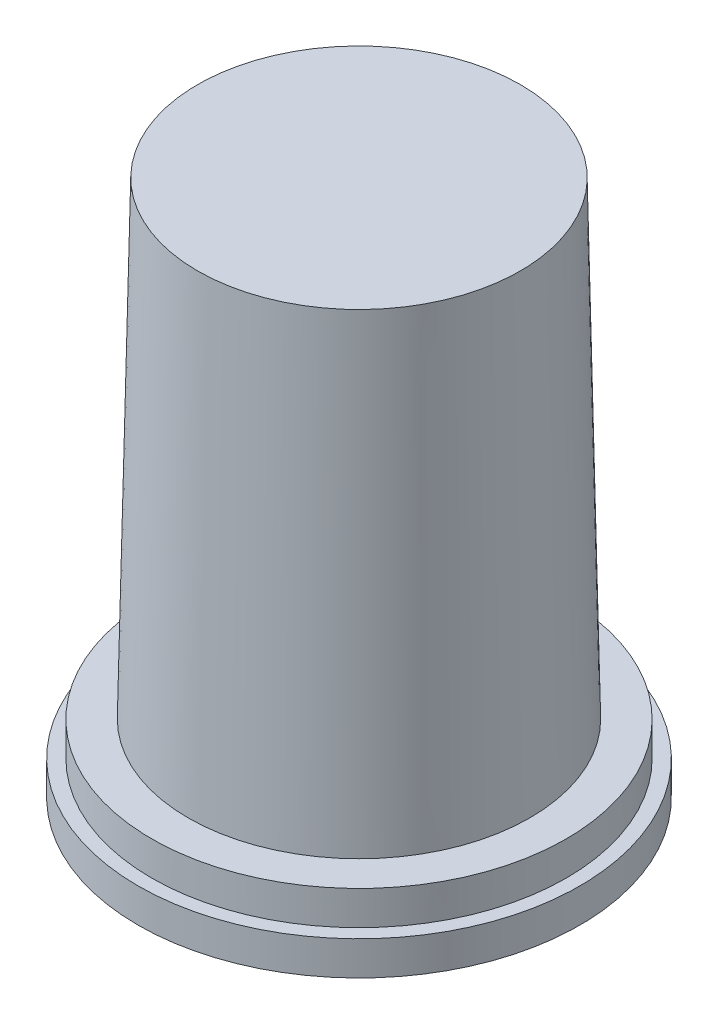
ISO-10303-21;
HEADER;
FILE_DESCRIPTION(('STEP AP214'),'2;1');
FILE_NAME('part.step','',(''),(''),'','','');
FILE_SCHEMA(('AUTOMOTIVE_DESIGN { 1 0 10303 214 1 1 1 1 }'));
ENDSEC;
DATA;
#1=APPLICATION_CONTEXT('core data for automotive mechanical design processes');
#2=APPLICATION_PROTOCOL_DEFINITION('international standard','automotive_design',2000,#1);
#3=PRODUCT_CONTEXT('',#1,'mechanical');
#4=PRODUCT('Part','Part','',(#3));
#5=PRODUCT_RELATED_PRODUCT_CATEGORY('part','',(#4));
#6=PRODUCT_DEFINITION_FORMATION('','',#4);
#7=PRODUCT_DEFINITION_CONTEXT('part definition',#1,'design');
#8=PRODUCT_DEFINITION('design','',#6,#7);
#9=PRODUCT_DEFINITION_SHAPE('','',#8);
#10=(LENGTH_UNIT() NAMED_UNIT(*) SI_UNIT(.MILLI.,.METRE.));
#11=(NAMED_UNIT(*) PLANE_ANGLE_UNIT() SI_UNIT($,.RADIAN.));
#12=(NAMED_UNIT(*) SI_UNIT($,.STERADIAN.) SOLID_ANGLE_UNIT());
#13=UNCERTAINTY_MEASURE_WITH_UNIT(LENGTH_MEASURE(1.E-05),#10,'distance_accuracy_value','');
#14=(GEOMETRIC_REPRESENTATION_CONTEXT(3) GLOBAL_UNCERTAINTY_ASSIGNED_CONTEXT((#13)) GLOBAL_UNIT_ASSIGNED_CONTEXT((#10,
#11,#12)) REPRESENTATION_CONTEXT('',''));
#15=CARTESIAN_POINT('',(0.,0.,0.));
#16=DIRECTION('',(0.,0.,1.));
#17=DIRECTION('',(1.,0.,0.));
#18=AXIS2_PLACEMENT_3D('',#15,#16,#17);
#19=CARTESIAN_POINT('',(5.05,1.,0.));
#20=DIRECTION('',(0.,1.,0.));
#21=DIRECTION('',(0.,0.,1.));
#22=AXIS2_PLACEMENT_3D('',#19,#20,#21);
#23=PLANE('',#22);
#24=CARTESIAN_POINT('',(0.,1.,0.));
#25=DIRECTION('',(0.,1.,0.));
#26=DIRECTION('',(0.,0.,1.));
#27=AXIS2_PLACEMENT_3D('',#24,#25,#26);
#28=CIRCLE('',#27,6.1);
#29=CARTESIAN_POINT('',(0.,1.,6.1));
#30=VERTEX_POINT('',#29);
#31=EDGE_CURVE('E50',#30,#30,#28,.T.);
#32=ORIENTED_EDGE('',*,*,#31,.F.);
#33=EDGE_LOOP('',(#32));
#34=FACE_BOUND('',#33,.T.);
#35=CARTESIAN_POINT('',(0.,1.,0.));
#36=DIRECTION('',(0.,-1.,0.));
#37=DIRECTION('',(0.,0.,-1.));
#38=AXIS2_PLACEMENT_3D('',#35,#36,#37);
#39=CIRCLE('',#38,6.5);
#40=CARTESIAN_POINT('',(0.,1.,-6.5));
#41=VERTEX_POINT('',#40);
#42=EDGE_CURVE('E58',#41,#41,#39,.T.);
#43=ORIENTED_EDGE('',*,*,#42,.F.);
#44=EDGE_LOOP('',(#43));
#45=FACE_BOUND('',#44,.T.);
#46=ADVANCED_FACE('F35',(#34,#45),#23,.T.);
#47=CARTESIAN_POINT('',(0.,0.,0.));
#48=DIRECTION('',(0.,-1.,0.));
#49=DIRECTION('',(0.,0.,-1.));
#50=AXIS2_PLACEMENT_3D('',#47,#48,#49);
#51=CYLINDRICAL_SURFACE('',#50,6.5);
#52=ORIENTED_EDGE('',*,*,#42,.T.);
#53=EDGE_LOOP('',(#52));
#54=FACE_BOUND('',#53,.T.);
#55=CARTESIAN_POINT('',(0.,0.,0.));
#56=DIRECTION('',(0.,-1.,0.));
#57=DIRECTION('',(0.,0.,-1.));
#58=AXIS2_PLACEMENT_3D('',#55,#56,#57);
#59=CIRCLE('',#58,6.5);
#60=CARTESIAN_POINT('',(0.,0.,-6.5));
#61=VERTEX_POINT('',#60);
#62=EDGE_CURVE('E61',#61,#61,#59,.T.);
#63=ORIENTED_EDGE('',*,*,#62,.F.);
#64=EDGE_LOOP('',(#63));
#65=FACE_BOUND('',#64,.T.);
#66=ADVANCED_FACE('F89',(#54,#65),#51,.T.);
#67=CARTESIAN_POINT('',(6.5,0.,0.));
#68=DIRECTION('',(0.,-1.,0.));
#69=DIRECTION('',(0.,0.,-1.));
#70=AXIS2_PLACEMENT_3D('',#67,#68,#69);
#71=PLANE('',#70);
#72=CARTESIAN_POINT('',(0.,0.,0.));
#73=DIRECTION('',(0.,-1.,0.));
#74=DIRECTION('',(0.,0.,-1.));
#75=AXIS2_PLACEMENT_3D('',#72,#73,#74);
#76=CIRCLE('',#75,4.56003242472036);
#77=CARTESIAN_POINT('',(0.,0.,-4.56003242472036));
#78=VERTEX_POINT('',#77);
#79=EDGE_CURVE('E10',#78,#78,#76,.F.);
#80=ORIENTED_EDGE('',*,*,#79,.T.);
#81=EDGE_LOOP('',(#80));
#82=FACE_BOUND('',#81,.T.);
#83=ORIENTED_EDGE('',*,*,#62,.T.);
#84=EDGE_LOOP('',(#83));
#85=FACE_BOUND('',#84,.T.);
#86=ADVANCED_FACE('F95',(#82,#85),#71,.T.);
#87=CARTESIAN_POINT('',(0.,14.1,0.));
#88=DIRECTION('',(0.,-1.,0.));
#89=DIRECTION('',(0.,0.,-1.));
#90=AXIS2_PLACEMENT_3D('',#87,#88,#89);
#91=CONICAL_SURFACE('',#90,3.7842540386299,0.0202674947122217);
#92=CARTESIAN_POINT('',(0.,0.489866946405126,0.));
#93=DIRECTION('',(0.,1.,0.));
#94=DIRECTION('',(0.,0.,1.));
#95=AXIS2_PLACEMENT_3D('',#92,#93,#94);
#96=CIRCLE('',#95,4.06013511404061);
#97=CARTESIAN_POINT('',(0.,0.489866946405126,4.06013511404061));
#98=VERTEX_POINT('',#97);
#99=EDGE_CURVE('E42',#98,#98,#96,.F.);
#100=ORIENTED_EDGE('',*,*,#99,.T.);
#101=EDGE_LOOP('',(#100));
#102=FACE_BOUND('',#101,.T.);
#103=CARTESIAN_POINT('',(0.,14.1,0.));
#104=DIRECTION('',(0.,-1.,0.));
#105=DIRECTION('',(0.,0.,-1.));
#106=AXIS2_PLACEMENT_3D('',#103,#104,#105);
#107=CIRCLE('',#106,3.7842540386299);
#108=CARTESIAN_POINT('',(0.,14.1,-3.7842540386299));
#109=VERTEX_POINT('',#108);
#110=EDGE_CURVE('E64',#109,#109,#107,.T.);
#111=ORIENTED_EDGE('',*,*,#110,.F.);
#112=EDGE_LOOP('',(#111));
#113=FACE_BOUND('',#112,.T.);
#114=ADVANCED_FACE('F85',(#102,#113),#91,.F.);
#115=CARTESIAN_POINT('',(3.7842540386299,14.1,0.));
#116=DIRECTION('',(0.,-1.,0.));
#117=DIRECTION('',(0.,0.,-1.));
#118=AXIS2_PLACEMENT_3D('',#115,#116,#117);
#119=PLANE('',#118);
#120=ORIENTED_EDGE('',*,*,#110,.T.);
#121=EDGE_LOOP('',(#120));
#122=FACE_BOUND('',#121,.T.);
#123=ADVANCED_FACE('F76',(#122),#119,.T.);
#124=CARTESIAN_POINT('',(5.02972972972973,2.,0.));
#125=DIRECTION('',(0.,1.,0.));
#126=DIRECTION('',(0.,0.,1.));
#127=AXIS2_PLACEMENT_3D('',#124,#125,#126);
#128=PLANE('',#127);
#129=CARTESIAN_POINT('',(0.,2.,0.));
#130=DIRECTION('',(0.,1.,0.));
#131=DIRECTION('',(0.,0.,1.));
#132=AXIS2_PLACEMENT_3D('',#129,#130,#131);
#133=CIRCLE('',#132,5.02972972972973);
#134=CARTESIAN_POINT('',(0.,2.,5.02972972972973));
#135=VERTEX_POINT('',#134);
#136=EDGE_CURVE('E46',#135,#135,#133,.F.);
#137=ORIENTED_EDGE('',*,*,#136,.T.);
#138=EDGE_LOOP('',(#137));
#139=FACE_BOUND('',#138,.T.);
#140=CARTESIAN_POINT('',(0.,2.,0.));
#141=DIRECTION('',(0.,-1.,0.));
#142=DIRECTION('',(0.,0.,-1.));
#143=AXIS2_PLACEMENT_3D('',#140,#141,#142);
#144=CIRCLE('',#143,6.1);
#145=CARTESIAN_POINT('',(0.,2.,-6.1));
#146=VERTEX_POINT('',#145);
#147=EDGE_CURVE('E67',#146,#146,#144,.T.);
#148=ORIENTED_EDGE('',*,*,#147,.F.);
#149=EDGE_LOOP('',(#148));
#150=FACE_BOUND('',#149,.T.);
#151=ADVANCED_FACE('F74',(#139,#150),#128,.T.);
#152=CARTESIAN_POINT('',(0.,1.,0.));
#153=DIRECTION('',(0.,-1.,0.));
#154=DIRECTION('',(0.,0.,-1.));
#155=AXIS2_PLACEMENT_3D('',#152,#153,#154);
#156=CYLINDRICAL_SURFACE('',#155,6.1);
#157=ORIENTED_EDGE('',*,*,#147,.T.);
#158=EDGE_LOOP('',(#157));
#159=FACE_BOUND('',#158,.T.);
#160=ORIENTED_EDGE('',*,*,#31,.T.);
#161=EDGE_LOOP('',(#160));
#162=FACE_BOUND('',#161,.T.);
#163=ADVANCED_FACE('F71',(#159,#162),#156,.T.);
#164=CARTESIAN_POINT('',(0.,15.8,0.));
#165=DIRECTION('',(0.,1.,0.));
#166=DIRECTION('',(0.,0.,1.));
#167=AXIS2_PLACEMENT_3D('',#164,#165,#166);
#168=PLANE('',#167);
#169=CARTESIAN_POINT('',(0.,15.8,0.));
#170=DIRECTION('',(0.,-1.,0.));
#171=DIRECTION('',(0.,0.,-1.));
#172=AXIS2_PLACEMENT_3D('',#169,#170,#171);
#173=CIRCLE('',#172,4.75);
#174=CARTESIAN_POINT('',(0.,15.8,-4.75));
#175=VERTEX_POINT('',#174);
#176=EDGE_CURVE('E55',#175,#175,#173,.T.);
#177=ORIENTED_EDGE('',*,*,#176,.F.);
#178=EDGE_LOOP('',(#177));
#179=FACE_BOUND('',#178,.T.);
#180=ADVANCED_FACE('F83',(#179),#168,.T.);
#181=CARTESIAN_POINT('',(0.,1.,0.));
#182=DIRECTION('',(0.,-1.,0.));
#183=DIRECTION('',(0.,0.,-1.));
#184=AXIS2_PLACEMENT_3D('',#181,#182,#183);
#185=CONICAL_SURFACE('',#184,5.05,0.0202674947122216);
#186=ORIENTED_EDGE('',*,*,#136,.F.);
#187=EDGE_LOOP('',(#186));
#188=FACE_BOUND('',#187,.T.);
#189=ORIENTED_EDGE('',*,*,#176,.T.);
#190=EDGE_LOOP('',(#189));
#191=FACE_BOUND('',#190,.T.);
#192=ADVANCED_FACE('F102',(#188,#191),#185,.T.);
#193=CARTESIAN_POINT('',(0.,0.5,0.));
#194=DIRECTION('',(0.,-1.,0.));
#195=DIRECTION('',(0.,0.,-1.));
#196=AXIS2_PLACEMENT_3D('',#193,#194,#195);
#197=TOROIDAL_SURFACE('',#196,4.56003242472036,0.5);
#198=ORIENTED_EDGE('',*,*,#79,.F.);
#199=EDGE_LOOP('',(#198));
#200=FACE_BOUND('',#199,.T.);
#201=ORIENTED_EDGE('',*,*,#99,.F.);
#202=EDGE_LOOP('',(#201));
#203=FACE_BOUND('',#202,.T.);
#204=ADVANCED_FACE('F37',(#200,#203),#197,.T.);
#205=CLOSED_SHELL('',(#46,#66,#86,#114,#123,#151,#163,#180,#192,#204));
#206=MANIFOLD_SOLID_BREP('B2',#205);
#207=ADVANCED_BREP_SHAPE_REPRESENTATION('',(#18,#206),#14);
#208=SHAPE_DEFINITION_REPRESENTATION(#9,#207);
ENDSEC;
END-ISO-10303-21;
